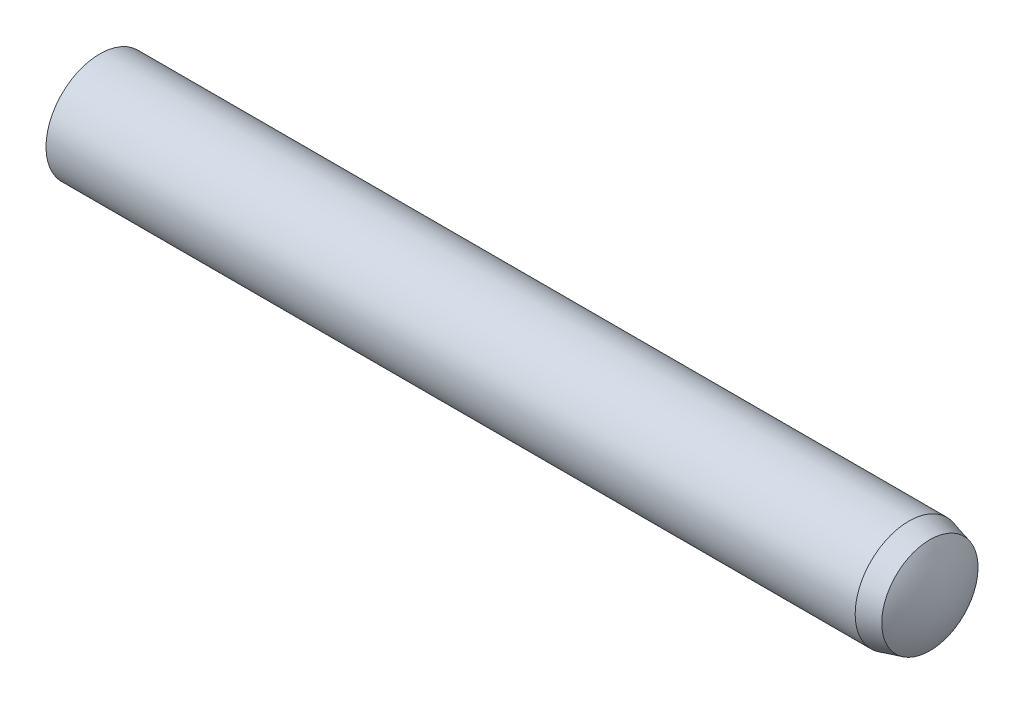
ISO-10303-21;
HEADER;
FILE_DESCRIPTION(('STEP AP214'),'2;1');
FILE_NAME('part.step','',(''),(''),'','','');
FILE_SCHEMA(('AUTOMOTIVE_DESIGN { 1 0 10303 214 1 1 1 1 }'));
ENDSEC;
DATA;
#1=APPLICATION_CONTEXT('core data for automotive mechanical design processes');
#2=APPLICATION_PROTOCOL_DEFINITION('international standard','automotive_design',2000,#1);
#3=PRODUCT_CONTEXT('',#1,'mechanical');
#4=PRODUCT('Part','Part','',(#3));
#5=PRODUCT_RELATED_PRODUCT_CATEGORY('part','',(#4));
#6=PRODUCT_DEFINITION_FORMATION('','',#4);
#7=PRODUCT_DEFINITION_CONTEXT('part definition',#1,'design');
#8=PRODUCT_DEFINITION('design','',#6,#7);
#9=PRODUCT_DEFINITION_SHAPE('','',#8);
#10=(LENGTH_UNIT() NAMED_UNIT(*) SI_UNIT(.MILLI.,.METRE.));
#11=(NAMED_UNIT(*) PLANE_ANGLE_UNIT() SI_UNIT($,.RADIAN.));
#12=(NAMED_UNIT(*) SI_UNIT($,.STERADIAN.) SOLID_ANGLE_UNIT());
#13=UNCERTAINTY_MEASURE_WITH_UNIT(LENGTH_MEASURE(1.E-05),#10,'distance_accuracy_value','');
#14=(GEOMETRIC_REPRESENTATION_CONTEXT(3) GLOBAL_UNCERTAINTY_ASSIGNED_CONTEXT((#13)) GLOBAL_UNIT_ASSIGNED_CONTEXT((#10,
#11,#12)) REPRESENTATION_CONTEXT('',''));
#15=CARTESIAN_POINT('',(0.,0.,0.));
#16=DIRECTION('',(0.,0.,1.));
#17=DIRECTION('',(1.,0.,0.));
#18=AXIS2_PLACEMENT_3D('',#15,#16,#17);
#19=CARTESIAN_POINT('',(-12.,0.,0.));
#20=DIRECTION('',(1.,0.,0.));
#21=DIRECTION('',(0.,0.,-1.));
#22=AXIS2_PLACEMENT_3D('',#19,#20,#21);
#23=CYLINDRICAL_SURFACE('',#22,1.5);
#24=CARTESIAN_POINT('',(11.025,0.,0.));
#25=DIRECTION('',(-1.,0.,0.));
#26=DIRECTION('',(0.,0.,1.));
#27=AXIS2_PLACEMENT_3D('',#24,#25,#26);
#28=CIRCLE('',#27,1.49999999999999);
#29=CARTESIAN_POINT('',(11.025,0.,1.49999999999999));
#30=VERTEX_POINT('',#29);
#31=EDGE_CURVE('E11',#30,#30,#28,.T.);
#32=ORIENTED_EDGE('',*,*,#31,.T.);
#33=EDGE_LOOP('',(#32));
#34=FACE_BOUND('',#33,.T.);
#35=CARTESIAN_POINT('',(-11.55,0.,0.));
#36=DIRECTION('',(-1.,0.,0.));
#37=DIRECTION('',(0.,0.,1.));
#38=AXIS2_PLACEMENT_3D('',#35,#36,#37);
#39=CIRCLE('',#38,1.5);
#40=CARTESIAN_POINT('',(-11.55,0.,1.5));
#41=VERTEX_POINT('',#40);
#42=EDGE_CURVE('E54',#41,#41,#39,.T.);
#43=ORIENTED_EDGE('',*,*,#42,.F.);
#44=EDGE_LOOP('',(#43));
#45=FACE_BOUND('',#44,.T.);
#46=ADVANCED_FACE('F34',(#34,#45),#23,.T.);
#47=CARTESIAN_POINT('',(11.025,0.,0.));
#48=DIRECTION('',(-1.,0.,0.));
#49=DIRECTION('',(0.,0.,1.));
#50=AXIS2_PLACEMENT_3D('',#47,#48,#49);
#51=CONICAL_SURFACE('',#50,1.49999999999999,0.261799387799151);
#52=CARTESIAN_POINT('',(11.61,0.,0.));
#53=DIRECTION('',(-1.,0.,0.));
#54=DIRECTION('',(0.,0.,1.));
#55=AXIS2_PLACEMENT_3D('',#52,#53,#54);
#56=CIRCLE('',#55,1.34324972242779);
#57=CARTESIAN_POINT('',(11.61,0.,1.34324972242779));
#58=VERTEX_POINT('',#57);
#59=EDGE_CURVE('E41',#58,#58,#56,.T.);
#60=ORIENTED_EDGE('',*,*,#59,.T.);
#61=EDGE_LOOP('',(#60));
#62=FACE_BOUND('',#61,.T.);
#63=ORIENTED_EDGE('',*,*,#31,.F.);
#64=EDGE_LOOP('',(#63));
#65=FACE_BOUND('',#64,.T.);
#66=ADVANCED_FACE('F60',(#62,#65),#51,.T.);
#67=CARTESIAN_POINT('',(9.49176946563808,0.,0.));
#68=DIRECTION('',(-1.,0.,0.));
#69=DIRECTION('',(0.,1.,0.));
#70=AXIS2_PLACEMENT_3D('',#67,#68,#69);
#71=SPHERICAL_SURFACE('',#70,2.50823053436192);
#72=CARTESIAN_POINT('',(12.,0.,0.));
#73=VERTEX_POINT('',#72);
#74=VERTEX_LOOP('',#73);
#75=FACE_BOUND('',#74,.T.);
#76=ORIENTED_EDGE('',*,*,#59,.F.);
#77=EDGE_LOOP('',(#76));
#78=FACE_BOUND('',#77,.T.);
#79=ADVANCED_FACE('F50',(#75,#78),#71,.T.);
#80=CARTESIAN_POINT('',(-9.27500000000001,0.,0.));
#81=DIRECTION('',(-1.,0.,0.));
#82=DIRECTION('',(0.,-1.,0.));
#83=AXIS2_PLACEMENT_3D('',#80,#81,#82);
#84=SPHERICAL_SURFACE('',#83,2.72499999999999);
#85=CARTESIAN_POINT('',(-12.,0.,0.));
#86=VERTEX_POINT('',#85);
#87=VERTEX_LOOP('',#86);
#88=FACE_BOUND('',#87,.T.);
#89=ORIENTED_EDGE('',*,*,#42,.T.);
#90=EDGE_LOOP('',(#89));
#91=FACE_BOUND('',#90,.T.);
#92=ADVANCED_FACE('F47',(#88,#91),#84,.T.);
#93=CLOSED_SHELL('',(#46,#66,#79,#92));
#94=MANIFOLD_SOLID_BREP('B2',#93);
#95=ADVANCED_BREP_SHAPE_REPRESENTATION('',(#18,#94),#14);
#96=SHAPE_DEFINITION_REPRESENTATION(#9,#95);
ENDSEC;
END-ISO-10303-21;
